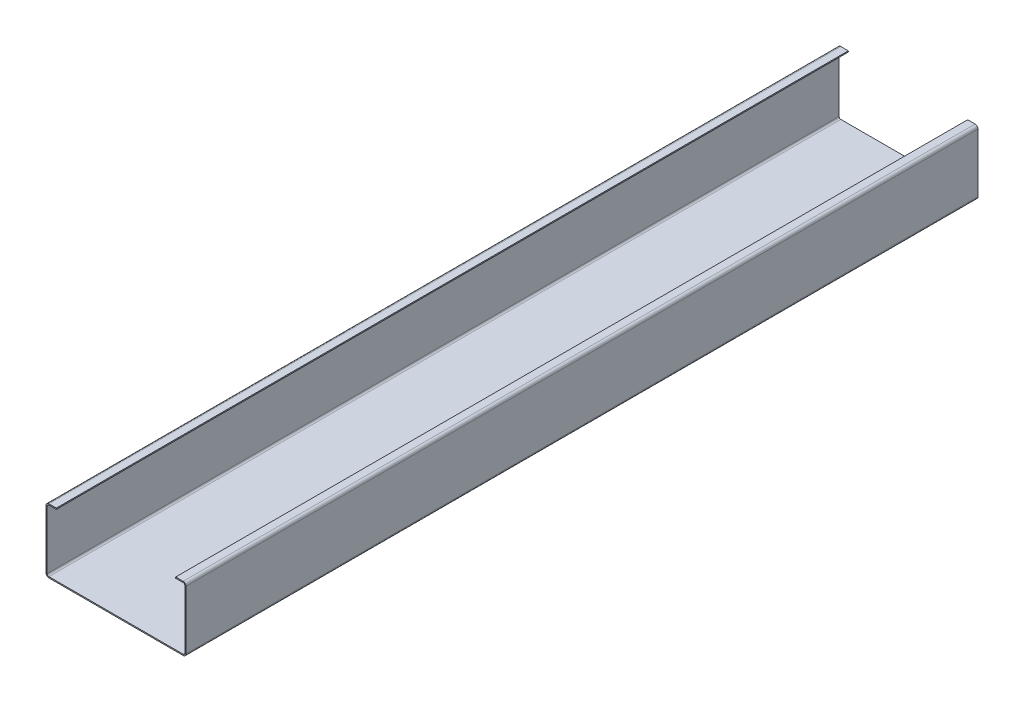
ISO-10303-21;
HEADER;
FILE_DESCRIPTION(('STEP AP214'),'2;1');
FILE_NAME('part.step','',(''),(''),'','','');
FILE_SCHEMA(('AUTOMOTIVE_DESIGN { 1 0 10303 214 1 1 1 1 }'));
ENDSEC;
DATA;
#1=APPLICATION_CONTEXT('core data for automotive mechanical design processes');
#2=APPLICATION_PROTOCOL_DEFINITION('international standard','automotive_design',2000,#1);
#3=PRODUCT_CONTEXT('',#1,'mechanical');
#4=PRODUCT('Part','Part','',(#3));
#5=PRODUCT_RELATED_PRODUCT_CATEGORY('part','',(#4));
#6=PRODUCT_DEFINITION_FORMATION('','',#4);
#7=PRODUCT_DEFINITION_CONTEXT('part definition',#1,'design');
#8=PRODUCT_DEFINITION('design','',#6,#7);
#9=PRODUCT_DEFINITION_SHAPE('','',#8);
#10=(LENGTH_UNIT() NAMED_UNIT(*) SI_UNIT(.MILLI.,.METRE.));
#11=(NAMED_UNIT(*) PLANE_ANGLE_UNIT() SI_UNIT($,.RADIAN.));
#12=(NAMED_UNIT(*) SI_UNIT($,.STERADIAN.) SOLID_ANGLE_UNIT());
#13=UNCERTAINTY_MEASURE_WITH_UNIT(LENGTH_MEASURE(1.E-05),#10,'distance_accuracy_value','');
#14=(GEOMETRIC_REPRESENTATION_CONTEXT(3) GLOBAL_UNCERTAINTY_ASSIGNED_CONTEXT((#13)) GLOBAL_UNIT_ASSIGNED_CONTEXT((#10,
#11,#12)) REPRESENTATION_CONTEXT('',''));
#15=CARTESIAN_POINT('',(0.,0.,0.));
#16=DIRECTION('',(0.,0.,1.));
#17=DIRECTION('',(1.,0.,0.));
#18=AXIS2_PLACEMENT_3D('',#15,#16,#17);
#19=CARTESIAN_POINT('',(-29.25,27.,-345.));
#20=DIRECTION('',(0.,0.,-1.));
#21=DIRECTION('',(-1.,0.,0.));
#22=AXIS2_PLACEMENT_3D('',#19,#20,#21);
#23=PLANE('',#22);
#24=DIRECTION('',(0.,1.,0.));
#25=VECTOR('',#24,1.);
#26=CARTESIAN_POINT('',(-29.25,27.,-345.));
#27=LINE('',#26,#25);
#28=CARTESIAN_POINT('',(-29.25,27.,-345.));
#29=VERTEX_POINT('',#28);
#30=CARTESIAN_POINT('',(-29.25,27.5,-345.));
#31=VERTEX_POINT('',#30);
#32=EDGE_CURVE('E11',#29,#31,#27,.T.);
#33=ORIENTED_EDGE('',*,*,#32,.F.);
#34=CARTESIAN_POINT('',(-29.25,26.25,-345.));
#35=DIRECTION('',(0.,0.,-1.));
#36=DIRECTION('',(-1.,0.,0.));
#37=AXIS2_PLACEMENT_3D('',#34,#35,#36);
#38=CIRCLE('',#37,0.75);
#39=CARTESIAN_POINT('',(-30.,26.25,-345.));
#40=VERTEX_POINT('',#39);
#41=EDGE_CURVE('E368',#29,#40,#38,.F.);
#42=ORIENTED_EDGE('',*,*,#41,.T.);
#43=DIRECTION('',(1.,0.,0.));
#44=VECTOR('',#43,1.);
#45=CARTESIAN_POINT('',(-30.5,26.25,-345.));
#46=LINE('',#45,#44);
#47=CARTESIAN_POINT('',(-30.5,26.25,-345.));
#48=VERTEX_POINT('',#47);
#49=EDGE_CURVE('E45',#48,#40,#46,.T.);
#50=ORIENTED_EDGE('',*,*,#49,.F.);
#51=CARTESIAN_POINT('',(-29.25,26.25,-345.));
#52=DIRECTION('',(0.,0.,1.));
#53=DIRECTION('',(1.,0.,0.));
#54=AXIS2_PLACEMENT_3D('',#51,#52,#53);
#55=CIRCLE('',#54,1.25);
#56=EDGE_CURVE('E393',#31,#48,#55,.T.);
#57=ORIENTED_EDGE('',*,*,#56,.F.);
#58=EDGE_LOOP('',(#33,#42,#50,#57));
#59=FACE_BOUND('',#58,.T.);
#60=ADVANCED_FACE('F37',(#59),#23,.T.);
#61=CARTESIAN_POINT('',(-30.5,26.25,-345.));
#62=DIRECTION('',(0.,0.,-1.));
#63=DIRECTION('',(-1.,0.,0.));
#64=AXIS2_PLACEMENT_3D('',#61,#62,#63);
#65=PLANE('',#64);
#66=DIRECTION('',(-1.,0.,0.));
#67=VECTOR('',#66,1.);
#68=CARTESIAN_POINT('',(-30.,27.,-345.));
#69=LINE('',#68,#67);
#70=CARTESIAN_POINT('',(-26.,27.,-345.));
#71=VERTEX_POINT('',#70);
#72=EDGE_CURVE('E372',#71,#29,#69,.T.);
#73=ORIENTED_EDGE('',*,*,#72,.T.);
#74=ORIENTED_EDGE('',*,*,#32,.T.);
#75=DIRECTION('',(1.,0.,0.));
#76=VECTOR('',#75,1.);
#77=CARTESIAN_POINT('',(-30.,27.5,-345.));
#78=LINE('',#77,#76);
#79=CARTESIAN_POINT('',(-26.,27.5,-345.));
#80=VERTEX_POINT('',#79);
#81=EDGE_CURVE('E390',#80,#31,#78,.F.);
#82=ORIENTED_EDGE('',*,*,#81,.F.);
#83=DIRECTION('',(0.,-1.,0.));
#84=VECTOR('',#83,1.);
#85=CARTESIAN_POINT('',(-26.,27.5,-345.));
#86=LINE('',#85,#84);
#87=EDGE_CURVE('E388',#80,#71,#86,.T.);
#88=ORIENTED_EDGE('',*,*,#87,.T.);
#89=EDGE_LOOP('',(#73,#74,#82,#88));
#90=FACE_BOUND('',#89,.T.);
#91=ADVANCED_FACE('F418',(#90),#65,.T.);
#92=CARTESIAN_POINT('',(-30.,26.25,0.));
#93=DIRECTION('',(0.,0.,1.));
#94=DIRECTION('',(1.,0.,0.));
#95=AXIS2_PLACEMENT_3D('',#92,#93,#94);
#96=PLANE('',#95);
#97=DIRECTION('',(-1.,0.,0.));
#98=VECTOR('',#97,1.);
#99=CARTESIAN_POINT('',(-30.,26.25,0.));
#100=LINE('',#99,#98);
#101=CARTESIAN_POINT('',(-30.,26.25,0.));
#102=VERTEX_POINT('',#101);
#103=CARTESIAN_POINT('',(-30.5,26.25,0.));
#104=VERTEX_POINT('',#103);
#105=EDGE_CURVE('E352',#102,#104,#100,.T.);
#106=ORIENTED_EDGE('',*,*,#105,.F.);
#107=CARTESIAN_POINT('',(-29.25,26.25,0.));
#108=DIRECTION('',(0.,0.,-1.));
#109=DIRECTION('',(-1.,0.,0.));
#110=AXIS2_PLACEMENT_3D('',#107,#108,#109);
#111=CIRCLE('',#110,0.75);
#112=CARTESIAN_POINT('',(-29.25,27.,0.));
#113=VERTEX_POINT('',#112);
#114=EDGE_CURVE('E256',#113,#102,#111,.F.);
#115=ORIENTED_EDGE('',*,*,#114,.F.);
#116=DIRECTION('',(0.,-1.,0.));
#117=VECTOR('',#116,1.);
#118=CARTESIAN_POINT('',(-29.25,27.5,0.));
#119=LINE('',#118,#117);
#120=CARTESIAN_POINT('',(-29.25,27.5,0.));
#121=VERTEX_POINT('',#120);
#122=EDGE_CURVE('E350',#121,#113,#119,.T.);
#123=ORIENTED_EDGE('',*,*,#122,.F.);
#124=CARTESIAN_POINT('',(-29.25,26.25,0.));
#125=DIRECTION('',(0.,0.,1.));
#126=DIRECTION('',(1.,0.,0.));
#127=AXIS2_PLACEMENT_3D('',#124,#125,#126);
#128=CIRCLE('',#127,1.25);
#129=EDGE_CURVE('E267',#121,#104,#128,.T.);
#130=ORIENTED_EDGE('',*,*,#129,.T.);
#131=EDGE_LOOP('',(#106,#115,#123,#130));
#132=FACE_BOUND('',#131,.T.);
#133=ADVANCED_FACE('F426',(#132),#96,.T.);
#134=CARTESIAN_POINT('',(-29.25,27.5,0.));
#135=DIRECTION('',(0.,0.,1.));
#136=DIRECTION('',(1.,0.,0.));
#137=AXIS2_PLACEMENT_3D('',#134,#135,#136);
#138=PLANE('',#137);
#139=DIRECTION('',(0.,-1.,0.));
#140=VECTOR('',#139,1.);
#141=CARTESIAN_POINT('',(-30.,-1.39761000804391E-13,0.));
#142=LINE('',#141,#140);
#143=CARTESIAN_POINT('',(-30.,0.749999999999862,0.));
#144=VERTEX_POINT('',#143);
#145=EDGE_CURVE('E253',#102,#144,#142,.T.);
#146=ORIENTED_EDGE('',*,*,#145,.F.);
#147=ORIENTED_EDGE('',*,*,#105,.T.);
#148=DIRECTION('',(0.,1.,0.));
#149=VECTOR('',#148,1.);
#150=CARTESIAN_POINT('',(-30.5,-1.39761000804391E-13,0.));
#151=LINE('',#150,#149);
#152=CARTESIAN_POINT('',(-30.5,0.749999999999862,0.));
#153=VERTEX_POINT('',#152);
#154=EDGE_CURVE('E270',#104,#153,#151,.F.);
#155=ORIENTED_EDGE('',*,*,#154,.T.);
#156=DIRECTION('',(1.,0.,0.));
#157=VECTOR('',#156,1.);
#158=CARTESIAN_POINT('',(-30.5,0.749999999999862,0.));
#159=LINE('',#158,#157);
#160=EDGE_CURVE('E342',#153,#144,#159,.T.);
#161=ORIENTED_EDGE('',*,*,#160,.T.);
#162=EDGE_LOOP('',(#146,#147,#155,#161));
#163=FACE_BOUND('',#162,.T.);
#164=ADVANCED_FACE('F428',(#163),#138,.T.);
#165=CARTESIAN_POINT('',(-30.,0.749999999999862,-345.));
#166=DIRECTION('',(0.,0.,-1.));
#167=DIRECTION('',(-1.,0.,0.));
#168=AXIS2_PLACEMENT_3D('',#165,#166,#167);
#169=PLANE('',#168);
#170=DIRECTION('',(-1.,0.,0.));
#171=VECTOR('',#170,1.);
#172=CARTESIAN_POINT('',(-30.,0.749999999999862,-345.));
#173=LINE('',#172,#171);
#174=CARTESIAN_POINT('',(-30.,0.749999999999862,-345.));
#175=VERTEX_POINT('',#174);
#176=CARTESIAN_POINT('',(-30.5,0.749999999999862,-345.));
#177=VERTEX_POINT('',#176);
#178=EDGE_CURVE('E348',#175,#177,#173,.T.);
#179=ORIENTED_EDGE('',*,*,#178,.F.);
#180=CARTESIAN_POINT('',(-29.25,0.749999999999862,-345.));
#181=DIRECTION('',(0.,0.,-1.));
#182=DIRECTION('',(-1.,0.,0.));
#183=AXIS2_PLACEMENT_3D('',#180,#181,#182);
#184=CIRCLE('',#183,0.75);
#185=CARTESIAN_POINT('',(-29.25,-1.38013988294336E-13,-345.));
#186=VERTEX_POINT('',#185);
#187=EDGE_CURVE('E380',#175,#186,#184,.F.);
#188=ORIENTED_EDGE('',*,*,#187,.T.);
#189=DIRECTION('',(0.,1.,0.));
#190=VECTOR('',#189,1.);
#191=CARTESIAN_POINT('',(-29.25,-0.500000000000138,-345.));
#192=LINE('',#191,#190);
#193=CARTESIAN_POINT('',(-29.25,-0.500000000000138,-345.));
#194=VERTEX_POINT('',#193);
#195=EDGE_CURVE('E346',#194,#186,#192,.T.);
#196=ORIENTED_EDGE('',*,*,#195,.F.);
#197=CARTESIAN_POINT('',(-29.25,0.749999999999862,-345.));
#198=DIRECTION('',(0.,0.,1.));
#199=DIRECTION('',(1.,0.,0.));
#200=AXIS2_PLACEMENT_3D('',#197,#198,#199);
#201=CIRCLE('',#200,1.25);
#202=EDGE_CURVE('E224',#177,#194,#201,.T.);
#203=ORIENTED_EDGE('',*,*,#202,.F.);
#204=EDGE_LOOP('',(#179,#188,#196,#203));
#205=FACE_BOUND('',#204,.T.);
#206=ADVANCED_FACE('F404',(#205),#169,.T.);
#207=CARTESIAN_POINT('',(-29.25,-0.500000000000138,-345.));
#208=DIRECTION('',(0.,0.,-1.));
#209=DIRECTION('',(-1.,0.,0.));
#210=AXIS2_PLACEMENT_3D('',#207,#208,#209);
#211=PLANE('',#210);
#212=DIRECTION('',(0.,-1.,0.));
#213=VECTOR('',#212,1.);
#214=CARTESIAN_POINT('',(-30.,-1.39761000804391E-13,-345.));
#215=LINE('',#214,#213);
#216=EDGE_CURVE('E359',#40,#175,#215,.T.);
#217=ORIENTED_EDGE('',*,*,#216,.T.);
#218=ORIENTED_EDGE('',*,*,#178,.T.);
#219=DIRECTION('',(0.,1.,0.));
#220=VECTOR('',#219,1.);
#221=CARTESIAN_POINT('',(-30.5,-1.39761000804391E-13,-345.));
#222=LINE('',#221,#220);
#223=EDGE_CURVE('E362',#48,#177,#222,.F.);
#224=ORIENTED_EDGE('',*,*,#223,.F.);
#225=ORIENTED_EDGE('',*,*,#49,.T.);
#226=EDGE_LOOP('',(#217,#218,#224,#225));
#227=FACE_BOUND('',#226,.T.);
#228=ADVANCED_FACE('F357',(#227),#211,.T.);
#229=CARTESIAN_POINT('',(-29.25,-1.38013988294336E-13,0.));
#230=DIRECTION('',(0.,0.,1.));
#231=DIRECTION('',(1.,0.,0.));
#232=AXIS2_PLACEMENT_3D('',#229,#230,#231);
#233=PLANE('',#232);
#234=DIRECTION('',(0.,-1.,0.));
#235=VECTOR('',#234,1.);
#236=CARTESIAN_POINT('',(-29.25,-1.38013988294336E-13,0.));
#237=LINE('',#236,#235);
#238=CARTESIAN_POINT('',(-29.25,-1.38013988294336E-13,0.));
#239=VERTEX_POINT('',#238);
#240=CARTESIAN_POINT('',(-29.25,-0.500000000000138,0.));
#241=VERTEX_POINT('',#240);
#242=EDGE_CURVE('E344',#239,#241,#237,.T.);
#243=ORIENTED_EDGE('',*,*,#242,.F.);
#244=CARTESIAN_POINT('',(-29.25,0.749999999999862,0.));
#245=DIRECTION('',(0.,0.,-1.));
#246=DIRECTION('',(-1.,0.,0.));
#247=AXIS2_PLACEMENT_3D('',#244,#245,#246);
#248=CIRCLE('',#247,0.75);
#249=EDGE_CURVE('E250',#144,#239,#248,.F.);
#250=ORIENTED_EDGE('',*,*,#249,.F.);
#251=ORIENTED_EDGE('',*,*,#160,.F.);
#252=CARTESIAN_POINT('',(-29.25,0.749999999999862,0.));
#253=DIRECTION('',(0.,0.,1.));
#254=DIRECTION('',(1.,0.,0.));
#255=AXIS2_PLACEMENT_3D('',#252,#253,#254);
#256=CIRCLE('',#255,1.25);
#257=EDGE_CURVE('E273',#153,#241,#256,.T.);
#258=ORIENTED_EDGE('',*,*,#257,.T.);
#259=EDGE_LOOP('',(#243,#250,#251,#258));
#260=FACE_BOUND('',#259,.T.);
#261=ADVANCED_FACE('F434',(#260),#233,.T.);
#262=CARTESIAN_POINT('',(-30.5,0.749999999999862,0.));
#263=DIRECTION('',(0.,0.,1.));
#264=DIRECTION('',(1.,0.,0.));
#265=AXIS2_PLACEMENT_3D('',#262,#263,#264);
#266=PLANE('',#265);
#267=DIRECTION('',(1.,0.,0.));
#268=VECTOR('',#267,1.);
#269=CARTESIAN_POINT('',(-30.,-1.39761000804391E-13,0.));
#270=LINE('',#269,#268);
#271=CARTESIAN_POINT('',(29.25,0.,0.));
#272=VERTEX_POINT('',#271);
#273=EDGE_CURVE('E247',#239,#272,#270,.T.);
#274=ORIENTED_EDGE('',*,*,#273,.F.);
#275=ORIENTED_EDGE('',*,*,#242,.T.);
#276=DIRECTION('',(1.,0.,0.));
#277=VECTOR('',#276,1.);
#278=CARTESIAN_POINT('',(-30.,-0.50000000000014,0.));
#279=LINE('',#278,#277);
#280=CARTESIAN_POINT('',(29.25,-0.500000000000002,0.));
#281=VERTEX_POINT('',#280);
#282=EDGE_CURVE('E276',#241,#281,#279,.T.);
#283=ORIENTED_EDGE('',*,*,#282,.T.);
#284=DIRECTION('',(0.,1.,0.));
#285=VECTOR('',#284,1.);
#286=CARTESIAN_POINT('',(29.25,-0.500000000000002,0.));
#287=LINE('',#286,#285);
#288=EDGE_CURVE('E338',#281,#272,#287,.T.);
#289=ORIENTED_EDGE('',*,*,#288,.T.);
#290=EDGE_LOOP('',(#274,#275,#283,#289));
#291=FACE_BOUND('',#290,.T.);
#292=ADVANCED_FACE('F437',(#291),#266,.T.);
#293=CARTESIAN_POINT('',(29.25,0.,-345.));
#294=DIRECTION('',(0.,0.,-1.));
#295=DIRECTION('',(-1.,0.,0.));
#296=AXIS2_PLACEMENT_3D('',#293,#294,#295);
#297=PLANE('',#296);
#298=DIRECTION('',(0.,-1.,0.));
#299=VECTOR('',#298,1.);
#300=CARTESIAN_POINT('',(29.25,0.,-345.));
#301=LINE('',#300,#299);
#302=CARTESIAN_POINT('',(29.25,0.,-345.));
#303=VERTEX_POINT('',#302);
#304=CARTESIAN_POINT('',(29.25,-0.500000000000002,-345.));
#305=VERTEX_POINT('',#304);
#306=EDGE_CURVE('E196',#303,#305,#301,.T.);
#307=ORIENTED_EDGE('',*,*,#306,.F.);
#308=CARTESIAN_POINT('',(29.25,0.749999999999998,-345.));
#309=DIRECTION('',(0.,0.,-1.));
#310=DIRECTION('',(-1.,0.,0.));
#311=AXIS2_PLACEMENT_3D('',#308,#309,#310);
#312=CIRCLE('',#311,0.75);
#313=CARTESIAN_POINT('',(30.,0.749999999999998,-345.));
#314=VERTEX_POINT('',#313);
#315=EDGE_CURVE('E191',#303,#314,#312,.F.);
#316=ORIENTED_EDGE('',*,*,#315,.T.);
#317=DIRECTION('',(-1.,0.,0.));
#318=VECTOR('',#317,1.);
#319=CARTESIAN_POINT('',(30.5,0.749999999999998,-345.));
#320=LINE('',#319,#318);
#321=CARTESIAN_POINT('',(30.5,0.749999999999998,-345.));
#322=VERTEX_POINT('',#321);
#323=EDGE_CURVE('E184',#322,#314,#320,.T.);
#324=ORIENTED_EDGE('',*,*,#323,.F.);
#325=CARTESIAN_POINT('',(29.25,0.749999999999998,-345.));
#326=DIRECTION('',(0.,0.,1.));
#327=DIRECTION('',(1.,0.,0.));
#328=AXIS2_PLACEMENT_3D('',#325,#326,#327);
#329=CIRCLE('',#328,1.25);
#330=EDGE_CURVE('E188',#305,#322,#329,.T.);
#331=ORIENTED_EDGE('',*,*,#330,.F.);
#332=EDGE_LOOP('',(#307,#316,#324,#331));
#333=FACE_BOUND('',#332,.T.);
#334=ADVANCED_FACE('F186',(#333),#297,.T.);
#335=CARTESIAN_POINT('',(30.5,0.749999999999998,-345.));
#336=DIRECTION('',(0.,0.,-1.));
#337=DIRECTION('',(-1.,0.,0.));
#338=AXIS2_PLACEMENT_3D('',#335,#336,#337);
#339=PLANE('',#338);
#340=DIRECTION('',(1.,0.,0.));
#341=VECTOR('',#340,1.);
#342=CARTESIAN_POINT('',(-30.,-1.39761000804391E-13,-345.));
#343=LINE('',#342,#341);
#344=EDGE_CURVE('E383',#186,#303,#343,.T.);
#345=ORIENTED_EDGE('',*,*,#344,.T.);
#346=ORIENTED_EDGE('',*,*,#306,.T.);
#347=DIRECTION('',(1.,0.,0.));
#348=VECTOR('',#347,1.);
#349=CARTESIAN_POINT('',(-30.,-0.50000000000014,-345.));
#350=LINE('',#349,#348);
#351=EDGE_CURVE('E222',#194,#305,#350,.T.);
#352=ORIENTED_EDGE('',*,*,#351,.F.);
#353=ORIENTED_EDGE('',*,*,#195,.T.);
#354=EDGE_LOOP('',(#345,#346,#352,#353));
#355=FACE_BOUND('',#354,.T.);
#356=ADVANCED_FACE('F485',(#355),#339,.T.);
#357=CARTESIAN_POINT('',(30.,0.749999999999998,0.));
#358=DIRECTION('',(0.,0.,1.));
#359=DIRECTION('',(1.,0.,0.));
#360=AXIS2_PLACEMENT_3D('',#357,#358,#359);
#361=PLANE('',#360);
#362=DIRECTION('',(1.,0.,0.));
#363=VECTOR('',#362,1.);
#364=CARTESIAN_POINT('',(30.,0.749999999999998,0.));
#365=LINE('',#364,#363);
#366=CARTESIAN_POINT('',(30.,0.749999999999998,0.));
#367=VERTEX_POINT('',#366);
#368=CARTESIAN_POINT('',(30.5,0.749999999999998,0.));
#369=VERTEX_POINT('',#368);
#370=EDGE_CURVE('E197',#367,#369,#365,.T.);
#371=ORIENTED_EDGE('',*,*,#370,.F.);
#372=CARTESIAN_POINT('',(29.25,0.749999999999998,0.));
#373=DIRECTION('',(0.,0.,-1.));
#374=DIRECTION('',(-1.,0.,0.));
#375=AXIS2_PLACEMENT_3D('',#372,#373,#374);
#376=CIRCLE('',#375,0.75);
#377=EDGE_CURVE('E244',#272,#367,#376,.F.);
#378=ORIENTED_EDGE('',*,*,#377,.F.);
#379=ORIENTED_EDGE('',*,*,#288,.F.);
#380=CARTESIAN_POINT('',(29.25,0.749999999999998,0.));
#381=DIRECTION('',(0.,0.,1.));
#382=DIRECTION('',(1.,0.,0.));
#383=AXIS2_PLACEMENT_3D('',#380,#381,#382);
#384=CIRCLE('',#383,1.25);
#385=EDGE_CURVE('E279',#281,#369,#384,.T.);
#386=ORIENTED_EDGE('',*,*,#385,.T.);
#387=EDGE_LOOP('',(#371,#378,#379,#386));
#388=FACE_BOUND('',#387,.T.);
#389=ADVANCED_FACE('F446',(#388),#361,.T.);
#390=CARTESIAN_POINT('',(29.25,-0.500000000000002,0.));
#391=DIRECTION('',(0.,0.,1.));
#392=DIRECTION('',(1.,0.,0.));
#393=AXIS2_PLACEMENT_3D('',#390,#391,#392);
#394=PLANE('',#393);
#395=DIRECTION('',(0.,1.,0.));
#396=VECTOR('',#395,1.);
#397=CARTESIAN_POINT('',(30.,0.,0.));
#398=LINE('',#397,#396);
#399=CARTESIAN_POINT('',(30.,26.25,0.));
#400=VERTEX_POINT('',#399);
#401=EDGE_CURVE('E241',#367,#400,#398,.T.);
#402=ORIENTED_EDGE('',*,*,#401,.F.);
#403=ORIENTED_EDGE('',*,*,#370,.T.);
#404=DIRECTION('',(0.,1.,0.));
#405=VECTOR('',#404,1.);
#406=CARTESIAN_POINT('',(30.5,0.,0.));
#407=LINE('',#406,#405);
#408=CARTESIAN_POINT('',(30.5,26.25,0.));
#409=VERTEX_POINT('',#408);
#410=EDGE_CURVE('E207',#369,#409,#407,.T.);
#411=ORIENTED_EDGE('',*,*,#410,.T.);
#412=DIRECTION('',(-1.,0.,0.));
#413=VECTOR('',#412,1.);
#414=CARTESIAN_POINT('',(30.5,26.25,0.));
#415=LINE('',#414,#413);
#416=EDGE_CURVE('E118',#409,#400,#415,.T.);
#417=ORIENTED_EDGE('',*,*,#416,.T.);
#418=EDGE_LOOP('',(#402,#403,#411,#417));
#419=FACE_BOUND('',#418,.T.);
#420=ADVANCED_FACE('F449',(#419),#394,.T.);
#421=CARTESIAN_POINT('',(30.,26.25,-345.));
#422=DIRECTION('',(0.,0.,-1.));
#423=DIRECTION('',(-1.,0.,0.));
#424=AXIS2_PLACEMENT_3D('',#421,#422,#423);
#425=PLANE('',#424);
#426=DIRECTION('',(1.,0.,0.));
#427=VECTOR('',#426,1.);
#428=CARTESIAN_POINT('',(30.,26.25,-345.));
#429=LINE('',#428,#427);
#430=CARTESIAN_POINT('',(30.,26.25,-345.));
#431=VERTEX_POINT('',#430);
#432=CARTESIAN_POINT('',(30.5,26.25,-345.));
#433=VERTEX_POINT('',#432);
#434=EDGE_CURVE('E215',#431,#433,#429,.T.);
#435=ORIENTED_EDGE('',*,*,#434,.F.);
#436=CARTESIAN_POINT('',(29.25,26.25,-345.));
#437=DIRECTION('',(0.,0.,-1.));
#438=DIRECTION('',(-1.,0.,0.));
#439=AXIS2_PLACEMENT_3D('',#436,#437,#438);
#440=CIRCLE('',#439,0.75);
#441=CARTESIAN_POINT('',(29.25,27.,-345.));
#442=VERTEX_POINT('',#441);
#443=EDGE_CURVE('E459',#431,#442,#440,.F.);
#444=ORIENTED_EDGE('',*,*,#443,.T.);
#445=DIRECTION('',(0.,-1.,0.));
#446=VECTOR('',#445,1.);
#447=CARTESIAN_POINT('',(29.25,27.5,-345.));
#448=LINE('',#447,#446);
#449=CARTESIAN_POINT('',(29.25,27.5,-345.));
#450=VERTEX_POINT('',#449);
#451=EDGE_CURVE('E53',#450,#442,#448,.T.);
#452=ORIENTED_EDGE('',*,*,#451,.F.);
#453=CARTESIAN_POINT('',(29.25,26.25,-345.));
#454=DIRECTION('',(0.,0.,1.));
#455=DIRECTION('',(1.,0.,0.));
#456=AXIS2_PLACEMENT_3D('',#453,#454,#455);
#457=CIRCLE('',#456,1.25);
#458=EDGE_CURVE('E217',#433,#450,#457,.T.);
#459=ORIENTED_EDGE('',*,*,#458,.F.);
#460=EDGE_LOOP('',(#435,#444,#452,#459));
#461=FACE_BOUND('',#460,.T.);
#462=ADVANCED_FACE('F524',(#461),#425,.T.);
#463=CARTESIAN_POINT('',(29.25,27.5,-345.));
#464=DIRECTION('',(0.,0.,-1.));
#465=DIRECTION('',(-1.,0.,0.));
#466=AXIS2_PLACEMENT_3D('',#463,#464,#465);
#467=PLANE('',#466);
#468=DIRECTION('',(0.,1.,0.));
#469=VECTOR('',#468,1.);
#470=CARTESIAN_POINT('',(30.,0.,-345.));
#471=LINE('',#470,#469);
#472=EDGE_CURVE('E477',#314,#431,#471,.T.);
#473=ORIENTED_EDGE('',*,*,#472,.T.);
#474=ORIENTED_EDGE('',*,*,#434,.T.);
#475=DIRECTION('',(0.,1.,0.));
#476=VECTOR('',#475,1.);
#477=CARTESIAN_POINT('',(30.5,0.,-345.));
#478=LINE('',#477,#476);
#479=EDGE_CURVE('E205',#322,#433,#478,.T.);
#480=ORIENTED_EDGE('',*,*,#479,.F.);
#481=ORIENTED_EDGE('',*,*,#323,.T.);
#482=EDGE_LOOP('',(#473,#474,#480,#481));
#483=FACE_BOUND('',#482,.T.);
#484=ADVANCED_FACE('F214',(#483),#467,.T.);
#485=CARTESIAN_POINT('',(29.25,27.,0.));
#486=DIRECTION('',(0.,0.,1.));
#487=DIRECTION('',(1.,0.,0.));
#488=AXIS2_PLACEMENT_3D('',#485,#486,#487);
#489=PLANE('',#488);
#490=DIRECTION('',(0.,1.,0.));
#491=VECTOR('',#490,1.);
#492=CARTESIAN_POINT('',(29.25,27.,0.));
#493=LINE('',#492,#491);
#494=CARTESIAN_POINT('',(29.25,27.,0.));
#495=VERTEX_POINT('',#494);
#496=CARTESIAN_POINT('',(29.25,27.5,0.));
#497=VERTEX_POINT('',#496);
#498=EDGE_CURVE('E125',#495,#497,#493,.T.);
#499=ORIENTED_EDGE('',*,*,#498,.F.);
#500=CARTESIAN_POINT('',(29.25,26.25,0.));
#501=DIRECTION('',(0.,0.,-1.));
#502=DIRECTION('',(-1.,0.,0.));
#503=AXIS2_PLACEMENT_3D('',#500,#501,#502);
#504=CIRCLE('',#503,0.75);
#505=EDGE_CURVE('E238',#400,#495,#504,.F.);
#506=ORIENTED_EDGE('',*,*,#505,.F.);
#507=ORIENTED_EDGE('',*,*,#416,.F.);
#508=CARTESIAN_POINT('',(29.25,26.25,0.));
#509=DIRECTION('',(0.,0.,1.));
#510=DIRECTION('',(1.,0.,0.));
#511=AXIS2_PLACEMENT_3D('',#508,#509,#510);
#512=CIRCLE('',#511,1.25);
#513=EDGE_CURVE('E282',#409,#497,#512,.T.);
#514=ORIENTED_EDGE('',*,*,#513,.T.);
#515=EDGE_LOOP('',(#499,#506,#507,#514));
#516=FACE_BOUND('',#515,.T.);
#517=ADVANCED_FACE('F460',(#516),#489,.T.);
#518=CARTESIAN_POINT('',(30.5,26.25,0.));
#519=DIRECTION('',(0.,0.,1.));
#520=DIRECTION('',(1.,0.,0.));
#521=AXIS2_PLACEMENT_3D('',#518,#519,#520);
#522=PLANE('',#521);
#523=DIRECTION('',(-1.,0.,0.));
#524=VECTOR('',#523,1.);
#525=CARTESIAN_POINT('',(30.,27.,0.));
#526=LINE('',#525,#524);
#527=CARTESIAN_POINT('',(26.,27.,0.));
#528=VERTEX_POINT('',#527);
#529=EDGE_CURVE('E236',#495,#528,#526,.T.);
#530=ORIENTED_EDGE('',*,*,#529,.F.);
#531=ORIENTED_EDGE('',*,*,#498,.T.);
#532=DIRECTION('',(1.,0.,0.));
#533=VECTOR('',#532,1.);
#534=CARTESIAN_POINT('',(30.,27.5,0.));
#535=LINE('',#534,#533);
#536=CARTESIAN_POINT('',(26.,27.5,0.));
#537=VERTEX_POINT('',#536);
#538=EDGE_CURVE('E231',#497,#537,#535,.F.);
#539=ORIENTED_EDGE('',*,*,#538,.T.);
#540=DIRECTION('',(0.,1.,0.));
#541=VECTOR('',#540,1.);
#542=CARTESIAN_POINT('',(26.,27.,0.));
#543=LINE('',#542,#541);
#544=EDGE_CURVE('E233',#528,#537,#543,.T.);
#545=ORIENTED_EDGE('',*,*,#544,.F.);
#546=EDGE_LOOP('',(#530,#531,#539,#545));
#547=FACE_BOUND('',#546,.T.);
#548=ADVANCED_FACE('F468',(#547),#522,.T.);
#549=CARTESIAN_POINT('',(30.,27.5,-345.));
#550=DIRECTION('',(0.,1.,0.));
#551=DIRECTION('',(0.,0.,1.));
#552=AXIS2_PLACEMENT_3D('',#549,#550,#551);
#553=PLANE('',#552);
#554=ORIENTED_EDGE('',*,*,#538,.F.);
#555=DIRECTION('',(0.,0.,1.));
#556=VECTOR('',#555,1.);
#557=CARTESIAN_POINT('',(29.25,27.5,-345.));
#558=LINE('',#557,#556);
#559=EDGE_CURVE('E285',#450,#497,#558,.T.);
#560=ORIENTED_EDGE('',*,*,#559,.F.);
#561=DIRECTION('',(1.,0.,0.));
#562=VECTOR('',#561,1.);
#563=CARTESIAN_POINT('',(30.,27.5,-345.));
#564=LINE('',#563,#562);
#565=CARTESIAN_POINT('',(26.,27.5,-345.));
#566=VERTEX_POINT('',#565);
#567=EDGE_CURVE('E284',#450,#566,#564,.F.);
#568=ORIENTED_EDGE('',*,*,#567,.T.);
#569=DIRECTION('',(0.,0.,1.));
#570=VECTOR('',#569,1.);
#571=CARTESIAN_POINT('',(26.,27.5,-345.));
#572=LINE('',#571,#570);
#573=EDGE_CURVE('E230',#566,#537,#572,.T.);
#574=ORIENTED_EDGE('',*,*,#573,.T.);
#575=EDGE_LOOP('',(#554,#560,#568,#574));
#576=FACE_BOUND('',#575,.T.);
#577=ADVANCED_FACE('F466',(#576),#553,.T.);
#578=CARTESIAN_POINT('',(29.25,26.25,-345.));
#579=DIRECTION('',(0.,0.,1.));
#580=DIRECTION('',(1.,0.,0.));
#581=AXIS2_PLACEMENT_3D('',#578,#579,#580);
#582=CYLINDRICAL_SURFACE('',#581,1.25);
#583=ORIENTED_EDGE('',*,*,#513,.F.);
#584=DIRECTION('',(0.,0.,1.));
#585=VECTOR('',#584,1.);
#586=CARTESIAN_POINT('',(30.5,26.25,-345.));
#587=LINE('',#586,#585);
#588=EDGE_CURVE('E211',#433,#409,#587,.T.);
#589=ORIENTED_EDGE('',*,*,#588,.F.);
#590=ORIENTED_EDGE('',*,*,#458,.T.);
#591=ORIENTED_EDGE('',*,*,#559,.T.);
#592=EDGE_LOOP('',(#583,#589,#590,#591));
#593=FACE_BOUND('',#592,.T.);
#594=ADVANCED_FACE('F462',(#593),#582,.T.);
#595=CARTESIAN_POINT('',(30.5,0.,-345.));
#596=DIRECTION('',(1.,0.,0.));
#597=DIRECTION('',(0.,0.,-1.));
#598=AXIS2_PLACEMENT_3D('',#595,#596,#597);
#599=PLANE('',#598);
#600=ORIENTED_EDGE('',*,*,#410,.F.);
#601=DIRECTION('',(0.,0.,1.));
#602=VECTOR('',#601,1.);
#603=CARTESIAN_POINT('',(30.5,0.749999999999998,-345.));
#604=LINE('',#603,#602);
#605=EDGE_CURVE('E203',#322,#369,#604,.T.);
#606=ORIENTED_EDGE('',*,*,#605,.F.);
#607=ORIENTED_EDGE('',*,*,#479,.T.);
#608=ORIENTED_EDGE('',*,*,#588,.T.);
#609=EDGE_LOOP('',(#600,#606,#607,#608));
#610=FACE_BOUND('',#609,.T.);
#611=ADVANCED_FACE('F204',(#610),#599,.T.);
#612=CARTESIAN_POINT('',(29.25,0.749999999999998,-345.));
#613=DIRECTION('',(0.,0.,1.));
#614=DIRECTION('',(1.,0.,0.));
#615=AXIS2_PLACEMENT_3D('',#612,#613,#614);
#616=CYLINDRICAL_SURFACE('',#615,1.25);
#617=ORIENTED_EDGE('',*,*,#385,.F.);
#618=DIRECTION('',(0.,0.,1.));
#619=VECTOR('',#618,1.);
#620=CARTESIAN_POINT('',(29.25,-0.500000000000002,-345.));
#621=LINE('',#620,#619);
#622=EDGE_CURVE('E212',#305,#281,#621,.T.);
#623=ORIENTED_EDGE('',*,*,#622,.F.);
#624=ORIENTED_EDGE('',*,*,#330,.T.);
#625=ORIENTED_EDGE('',*,*,#605,.T.);
#626=EDGE_LOOP('',(#617,#623,#624,#625));
#627=FACE_BOUND('',#626,.T.);
#628=ADVANCED_FACE('F220',(#627),#616,.T.);
#629=CARTESIAN_POINT('',(-30.,-0.50000000000014,-345.));
#630=DIRECTION('',(0.,-1.,0.));
#631=DIRECTION('',(1.,0.,0.));
#632=AXIS2_PLACEMENT_3D('',#629,#630,#631);
#633=PLANE('',#632);
#634=ORIENTED_EDGE('',*,*,#282,.F.);
#635=DIRECTION('',(0.,0.,1.));
#636=VECTOR('',#635,1.);
#637=CARTESIAN_POINT('',(-29.25,-0.500000000000138,-345.));
#638=LINE('',#637,#636);
#639=EDGE_CURVE('E289',#194,#241,#638,.T.);
#640=ORIENTED_EDGE('',*,*,#639,.F.);
#641=ORIENTED_EDGE('',*,*,#351,.T.);
#642=ORIENTED_EDGE('',*,*,#622,.T.);
#643=EDGE_LOOP('',(#634,#640,#641,#642));
#644=FACE_BOUND('',#643,.T.);
#645=ADVANCED_FACE('F488',(#644),#633,.T.);
#646=CARTESIAN_POINT('',(-29.25,0.749999999999862,-345.));
#647=DIRECTION('',(0.,0.,1.));
#648=DIRECTION('',(1.,0.,0.));
#649=AXIS2_PLACEMENT_3D('',#646,#647,#648);
#650=CYLINDRICAL_SURFACE('',#649,1.25);
#651=ORIENTED_EDGE('',*,*,#257,.F.);
#652=DIRECTION('',(0.,0.,1.));
#653=VECTOR('',#652,1.);
#654=CARTESIAN_POINT('',(-30.5,0.749999999999862,-345.));
#655=LINE('',#654,#653);
#656=EDGE_CURVE('E292',#177,#153,#655,.T.);
#657=ORIENTED_EDGE('',*,*,#656,.F.);
#658=ORIENTED_EDGE('',*,*,#202,.T.);
#659=ORIENTED_EDGE('',*,*,#639,.T.);
#660=EDGE_LOOP('',(#651,#657,#658,#659));
#661=FACE_BOUND('',#660,.T.);
#662=ADVANCED_FACE('F400',(#661),#650,.T.);
#663=CARTESIAN_POINT('',(-30.5,-1.39761000804391E-13,-345.));
#664=DIRECTION('',(-1.,0.,0.));
#665=DIRECTION('',(0.,0.,1.));
#666=AXIS2_PLACEMENT_3D('',#663,#664,#665);
#667=PLANE('',#666);
#668=ORIENTED_EDGE('',*,*,#154,.F.);
#669=DIRECTION('',(0.,0.,1.));
#670=VECTOR('',#669,1.);
#671=CARTESIAN_POINT('',(-30.5,26.25,-345.));
#672=LINE('',#671,#670);
#673=EDGE_CURVE('E295',#48,#104,#672,.T.);
#674=ORIENTED_EDGE('',*,*,#673,.F.);
#675=ORIENTED_EDGE('',*,*,#223,.T.);
#676=ORIENTED_EDGE('',*,*,#656,.T.);
#677=EDGE_LOOP('',(#668,#674,#675,#676));
#678=FACE_BOUND('',#677,.T.);
#679=ADVANCED_FACE('F407',(#678),#667,.T.);
#680=CARTESIAN_POINT('',(-29.25,26.25,-345.));
#681=DIRECTION('',(0.,0.,1.));
#682=DIRECTION('',(1.,0.,0.));
#683=AXIS2_PLACEMENT_3D('',#680,#681,#682);
#684=CYLINDRICAL_SURFACE('',#683,1.25);
#685=ORIENTED_EDGE('',*,*,#129,.F.);
#686=DIRECTION('',(0.,0.,1.));
#687=VECTOR('',#686,1.);
#688=CARTESIAN_POINT('',(-29.25,27.5,-345.));
#689=LINE('',#688,#687);
#690=EDGE_CURVE('E298',#31,#121,#689,.T.);
#691=ORIENTED_EDGE('',*,*,#690,.F.);
#692=ORIENTED_EDGE('',*,*,#56,.T.);
#693=ORIENTED_EDGE('',*,*,#673,.T.);
#694=EDGE_LOOP('',(#685,#691,#692,#693));
#695=FACE_BOUND('',#694,.T.);
#696=ADVANCED_FACE('F410',(#695),#684,.T.);
#697=CARTESIAN_POINT('',(-30.,27.5,-345.));
#698=DIRECTION('',(0.,1.,0.));
#699=DIRECTION('',(0.,0.,1.));
#700=AXIS2_PLACEMENT_3D('',#697,#698,#699);
#701=PLANE('',#700);
#702=DIRECTION('',(1.,0.,0.));
#703=VECTOR('',#702,1.);
#704=CARTESIAN_POINT('',(-30.,27.5,0.));
#705=LINE('',#704,#703);
#706=CARTESIAN_POINT('',(-26.,27.5,0.));
#707=VERTEX_POINT('',#706);
#708=EDGE_CURVE('E264',#707,#121,#705,.F.);
#709=ORIENTED_EDGE('',*,*,#708,.F.);
#710=DIRECTION('',(0.,0.,1.));
#711=VECTOR('',#710,1.);
#712=CARTESIAN_POINT('',(-26.,27.5,-345.));
#713=LINE('',#712,#711);
#714=EDGE_CURVE('E301',#80,#707,#713,.T.);
#715=ORIENTED_EDGE('',*,*,#714,.F.);
#716=ORIENTED_EDGE('',*,*,#81,.T.);
#717=ORIENTED_EDGE('',*,*,#690,.T.);
#718=EDGE_LOOP('',(#709,#715,#716,#717));
#719=FACE_BOUND('',#718,.T.);
#720=ADVANCED_FACE('F415',(#719),#701,.T.);
#721=CARTESIAN_POINT('',(-26.,27.5,-345.));
#722=DIRECTION('',(-1.,0.,0.));
#723=DIRECTION('',(0.,0.,1.));
#724=AXIS2_PLACEMENT_3D('',#721,#722,#723);
#725=PLANE('',#724);
#726=DIRECTION('',(0.,-1.,0.));
#727=VECTOR('',#726,1.);
#728=CARTESIAN_POINT('',(-26.,27.5,0.));
#729=LINE('',#728,#727);
#730=CARTESIAN_POINT('',(-26.,27.,0.));
#731=VERTEX_POINT('',#730);
#732=EDGE_CURVE('E262',#707,#731,#729,.T.);
#733=ORIENTED_EDGE('',*,*,#732,.T.);
#734=DIRECTION('',(0.,0.,1.));
#735=VECTOR('',#734,1.);
#736=CARTESIAN_POINT('',(-26.,27.,-345.));
#737=LINE('',#736,#735);
#738=EDGE_CURVE('E303',#71,#731,#737,.T.);
#739=ORIENTED_EDGE('',*,*,#738,.F.);
#740=ORIENTED_EDGE('',*,*,#87,.F.);
#741=ORIENTED_EDGE('',*,*,#714,.T.);
#742=EDGE_LOOP('',(#733,#739,#740,#741));
#743=FACE_BOUND('',#742,.T.);
#744=ADVANCED_FACE('F556',(#743),#725,.F.);
#745=CARTESIAN_POINT('',(-30.,27.,-345.));
#746=DIRECTION('',(0.,1.,0.));
#747=DIRECTION('',(0.,0.,1.));
#748=AXIS2_PLACEMENT_3D('',#745,#746,#747);
#749=PLANE('',#748);
#750=DIRECTION('',(-1.,0.,0.));
#751=VECTOR('',#750,1.);
#752=CARTESIAN_POINT('',(-30.,27.,0.));
#753=LINE('',#752,#751);
#754=EDGE_CURVE('E259',#731,#113,#753,.T.);
#755=ORIENTED_EDGE('',*,*,#754,.T.);
#756=DIRECTION('',(0.,0.,1.));
#757=VECTOR('',#756,1.);
#758=CARTESIAN_POINT('',(-29.25,27.,-345.));
#759=LINE('',#758,#757);
#760=EDGE_CURVE('E306',#29,#113,#759,.T.);
#761=ORIENTED_EDGE('',*,*,#760,.F.);
#762=ORIENTED_EDGE('',*,*,#72,.F.);
#763=ORIENTED_EDGE('',*,*,#738,.T.);
#764=EDGE_LOOP('',(#755,#761,#762,#763));
#765=FACE_BOUND('',#764,.T.);
#766=ADVANCED_FACE('F423',(#765),#749,.F.);
#767=CARTESIAN_POINT('',(-29.25,26.25,-345.));
#768=DIRECTION('',(0.,0.,1.));
#769=DIRECTION('',(1.,0.,0.));
#770=AXIS2_PLACEMENT_3D('',#767,#768,#769);
#771=CYLINDRICAL_SURFACE('',#770,0.75);
#772=ORIENTED_EDGE('',*,*,#114,.T.);
#773=DIRECTION('',(0.,0.,1.));
#774=VECTOR('',#773,1.);
#775=CARTESIAN_POINT('',(-30.,26.25,-345.));
#776=LINE('',#775,#774);
#777=EDGE_CURVE('E309',#40,#102,#776,.T.);
#778=ORIENTED_EDGE('',*,*,#777,.F.);
#779=ORIENTED_EDGE('',*,*,#41,.F.);
#780=ORIENTED_EDGE('',*,*,#760,.T.);
#781=EDGE_LOOP('',(#772,#778,#779,#780));
#782=FACE_BOUND('',#781,.T.);
#783=ADVANCED_FACE('F374',(#782),#771,.F.);
#784=CARTESIAN_POINT('',(-30.,-1.39761000804391E-13,-345.));
#785=DIRECTION('',(-1.,0.,0.));
#786=DIRECTION('',(0.,0.,1.));
#787=AXIS2_PLACEMENT_3D('',#784,#785,#786);
#788=PLANE('',#787);
#789=ORIENTED_EDGE('',*,*,#145,.T.);
#790=DIRECTION('',(0.,0.,1.));
#791=VECTOR('',#790,1.);
#792=CARTESIAN_POINT('',(-30.,0.749999999999862,-345.));
#793=LINE('',#792,#791);
#794=EDGE_CURVE('E312',#175,#144,#793,.T.);
#795=ORIENTED_EDGE('',*,*,#794,.F.);
#796=ORIENTED_EDGE('',*,*,#216,.F.);
#797=ORIENTED_EDGE('',*,*,#777,.T.);
#798=EDGE_LOOP('',(#789,#795,#796,#797));
#799=FACE_BOUND('',#798,.T.);
#800=ADVANCED_FACE('F378',(#799),#788,.F.);
#801=CARTESIAN_POINT('',(-29.25,0.749999999999862,-345.));
#802=DIRECTION('',(0.,0.,1.));
#803=DIRECTION('',(1.,0.,0.));
#804=AXIS2_PLACEMENT_3D('',#801,#802,#803);
#805=CYLINDRICAL_SURFACE('',#804,0.75);
#806=ORIENTED_EDGE('',*,*,#249,.T.);
#807=DIRECTION('',(0.,0.,1.));
#808=VECTOR('',#807,1.);
#809=CARTESIAN_POINT('',(-29.25,-1.38013988294336E-13,-345.));
#810=LINE('',#809,#808);
#811=EDGE_CURVE('E315',#186,#239,#810,.T.);
#812=ORIENTED_EDGE('',*,*,#811,.F.);
#813=ORIENTED_EDGE('',*,*,#187,.F.);
#814=ORIENTED_EDGE('',*,*,#794,.T.);
#815=EDGE_LOOP('',(#806,#812,#813,#814));
#816=FACE_BOUND('',#815,.T.);
#817=ADVANCED_FACE('F431',(#816),#805,.F.);
#818=CARTESIAN_POINT('',(-30.,-1.39761000804391E-13,-345.));
#819=DIRECTION('',(0.,-1.,0.));
#820=DIRECTION('',(1.,0.,0.));
#821=AXIS2_PLACEMENT_3D('',#818,#819,#820);
#822=PLANE('',#821);
#823=ORIENTED_EDGE('',*,*,#273,.T.);
#824=DIRECTION('',(0.,0.,1.));
#825=VECTOR('',#824,1.);
#826=CARTESIAN_POINT('',(29.25,0.,-345.));
#827=LINE('',#826,#825);
#828=EDGE_CURVE('E318',#303,#272,#827,.T.);
#829=ORIENTED_EDGE('',*,*,#828,.F.);
#830=ORIENTED_EDGE('',*,*,#344,.F.);
#831=ORIENTED_EDGE('',*,*,#811,.T.);
#832=EDGE_LOOP('',(#823,#829,#830,#831));
#833=FACE_BOUND('',#832,.T.);
#834=ADVANCED_FACE('F440',(#833),#822,.F.);
#835=CARTESIAN_POINT('',(29.25,0.749999999999998,-345.));
#836=DIRECTION('',(0.,0.,1.));
#837=DIRECTION('',(1.,0.,0.));
#838=AXIS2_PLACEMENT_3D('',#835,#836,#837);
#839=CYLINDRICAL_SURFACE('',#838,0.75);
#840=ORIENTED_EDGE('',*,*,#377,.T.);
#841=DIRECTION('',(0.,0.,1.));
#842=VECTOR('',#841,1.);
#843=CARTESIAN_POINT('',(30.,0.749999999999998,-345.));
#844=LINE('',#843,#842);
#845=EDGE_CURVE('E321',#314,#367,#844,.T.);
#846=ORIENTED_EDGE('',*,*,#845,.F.);
#847=ORIENTED_EDGE('',*,*,#315,.F.);
#848=ORIENTED_EDGE('',*,*,#828,.T.);
#849=EDGE_LOOP('',(#840,#846,#847,#848));
#850=FACE_BOUND('',#849,.T.);
#851=ADVANCED_FACE('F444',(#850),#839,.F.);
#852=CARTESIAN_POINT('',(30.,0.,-345.));
#853=DIRECTION('',(1.,0.,0.));
#854=DIRECTION('',(0.,0.,-1.));
#855=AXIS2_PLACEMENT_3D('',#852,#853,#854);
#856=PLANE('',#855);
#857=ORIENTED_EDGE('',*,*,#401,.T.);
#858=DIRECTION('',(0.,0.,1.));
#859=VECTOR('',#858,1.);
#860=CARTESIAN_POINT('',(30.,26.25,-345.));
#861=LINE('',#860,#859);
#862=EDGE_CURVE('E324',#431,#400,#861,.T.);
#863=ORIENTED_EDGE('',*,*,#862,.F.);
#864=ORIENTED_EDGE('',*,*,#472,.F.);
#865=ORIENTED_EDGE('',*,*,#845,.T.);
#866=EDGE_LOOP('',(#857,#863,#864,#865));
#867=FACE_BOUND('',#866,.T.);
#868=ADVANCED_FACE('F453',(#867),#856,.F.);
#869=CARTESIAN_POINT('',(29.25,26.25,-345.));
#870=DIRECTION('',(0.,0.,1.));
#871=DIRECTION('',(1.,0.,0.));
#872=AXIS2_PLACEMENT_3D('',#869,#870,#871);
#873=CYLINDRICAL_SURFACE('',#872,0.75);
#874=ORIENTED_EDGE('',*,*,#505,.T.);
#875=DIRECTION('',(0.,0.,1.));
#876=VECTOR('',#875,1.);
#877=CARTESIAN_POINT('',(29.25,27.,-345.));
#878=LINE('',#877,#876);
#879=EDGE_CURVE('E327',#442,#495,#878,.T.);
#880=ORIENTED_EDGE('',*,*,#879,.F.);
#881=ORIENTED_EDGE('',*,*,#443,.F.);
#882=ORIENTED_EDGE('',*,*,#862,.T.);
#883=EDGE_LOOP('',(#874,#880,#881,#882));
#884=FACE_BOUND('',#883,.T.);
#885=ADVANCED_FACE('F457',(#884),#873,.F.);
#886=CARTESIAN_POINT('',(30.,27.,-345.));
#887=DIRECTION('',(0.,1.,0.));
#888=DIRECTION('',(0.,0.,1.));
#889=AXIS2_PLACEMENT_3D('',#886,#887,#888);
#890=PLANE('',#889);
#891=ORIENTED_EDGE('',*,*,#529,.T.);
#892=DIRECTION('',(0.,0.,1.));
#893=VECTOR('',#892,1.);
#894=CARTESIAN_POINT('',(26.,27.,-345.));
#895=LINE('',#894,#893);
#896=CARTESIAN_POINT('',(26.,27.,-345.));
#897=VERTEX_POINT('',#896);
#898=EDGE_CURVE('E330',#897,#528,#895,.T.);
#899=ORIENTED_EDGE('',*,*,#898,.F.);
#900=DIRECTION('',(-1.,0.,0.));
#901=VECTOR('',#900,1.);
#902=CARTESIAN_POINT('',(30.,27.,-345.));
#903=LINE('',#902,#901);
#904=EDGE_CURVE('E475',#442,#897,#903,.T.);
#905=ORIENTED_EDGE('',*,*,#904,.F.);
#906=ORIENTED_EDGE('',*,*,#879,.T.);
#907=EDGE_LOOP('',(#891,#899,#905,#906));
#908=FACE_BOUND('',#907,.T.);
#909=ADVANCED_FACE('F474',(#908),#890,.F.);
#910=CARTESIAN_POINT('',(26.,27.,-345.));
#911=DIRECTION('',(1.,0.,0.));
#912=DIRECTION('',(0.,0.,-1.));
#913=AXIS2_PLACEMENT_3D('',#910,#911,#912);
#914=PLANE('',#913);
#915=ORIENTED_EDGE('',*,*,#544,.T.);
#916=ORIENTED_EDGE('',*,*,#573,.F.);
#917=DIRECTION('',(0.,1.,0.));
#918=VECTOR('',#917,1.);
#919=CARTESIAN_POINT('',(26.,27.,-345.));
#920=LINE('',#919,#918);
#921=EDGE_CURVE('E134',#897,#566,#920,.T.);
#922=ORIENTED_EDGE('',*,*,#921,.F.);
#923=ORIENTED_EDGE('',*,*,#898,.T.);
#924=EDGE_LOOP('',(#915,#916,#922,#923));
#925=FACE_BOUND('',#924,.T.);
#926=ADVANCED_FACE('F470',(#925),#914,.F.);
#927=CARTESIAN_POINT('',(29.25,26.25,-345.));
#928=DIRECTION('',(0.,0.,-1.));
#929=DIRECTION('',(-1.,0.,0.));
#930=AXIS2_PLACEMENT_3D('',#927,#928,#929);
#931=PLANE('',#930);
#932=ORIENTED_EDGE('',*,*,#567,.F.);
#933=ORIENTED_EDGE('',*,*,#451,.T.);
#934=ORIENTED_EDGE('',*,*,#904,.T.);
#935=ORIENTED_EDGE('',*,*,#921,.T.);
#936=EDGE_LOOP('',(#932,#933,#934,#935));
#937=FACE_BOUND('',#936,.T.);
#938=ADVANCED_FACE('F537',(#937),#931,.T.);
#939=CARTESIAN_POINT('',(29.25,26.25,0.));
#940=DIRECTION('',(0.,0.,-1.));
#941=DIRECTION('',(-1.,0.,0.));
#942=AXIS2_PLACEMENT_3D('',#939,#940,#941);
#943=PLANE('',#942);
#944=ORIENTED_EDGE('',*,*,#708,.T.);
#945=ORIENTED_EDGE('',*,*,#122,.T.);
#946=ORIENTED_EDGE('',*,*,#754,.F.);
#947=ORIENTED_EDGE('',*,*,#732,.F.);
#948=EDGE_LOOP('',(#944,#945,#946,#947));
#949=FACE_BOUND('',#948,.T.);
#950=ADVANCED_FACE('F627',(#949),#943,.F.);
#951=CLOSED_SHELL('',(#60,#91,#133,#164,#206,#228,#261,#292,#334,#356,#389,#420,#462,#484,#517,
#548,#577,#594,#611,#628,#645,#662,#679,#696,#720,#744,#766,#783,#800,#817,#834,#851,#868,#885,
#909,#926,#938,#950));
#952=MANIFOLD_SOLID_BREP('B2',#951);
#953=ADVANCED_BREP_SHAPE_REPRESENTATION('',(#18,#952),#14);
#954=SHAPE_DEFINITION_REPRESENTATION(#9,#953);
ENDSEC;
END-ISO-10303-21;
